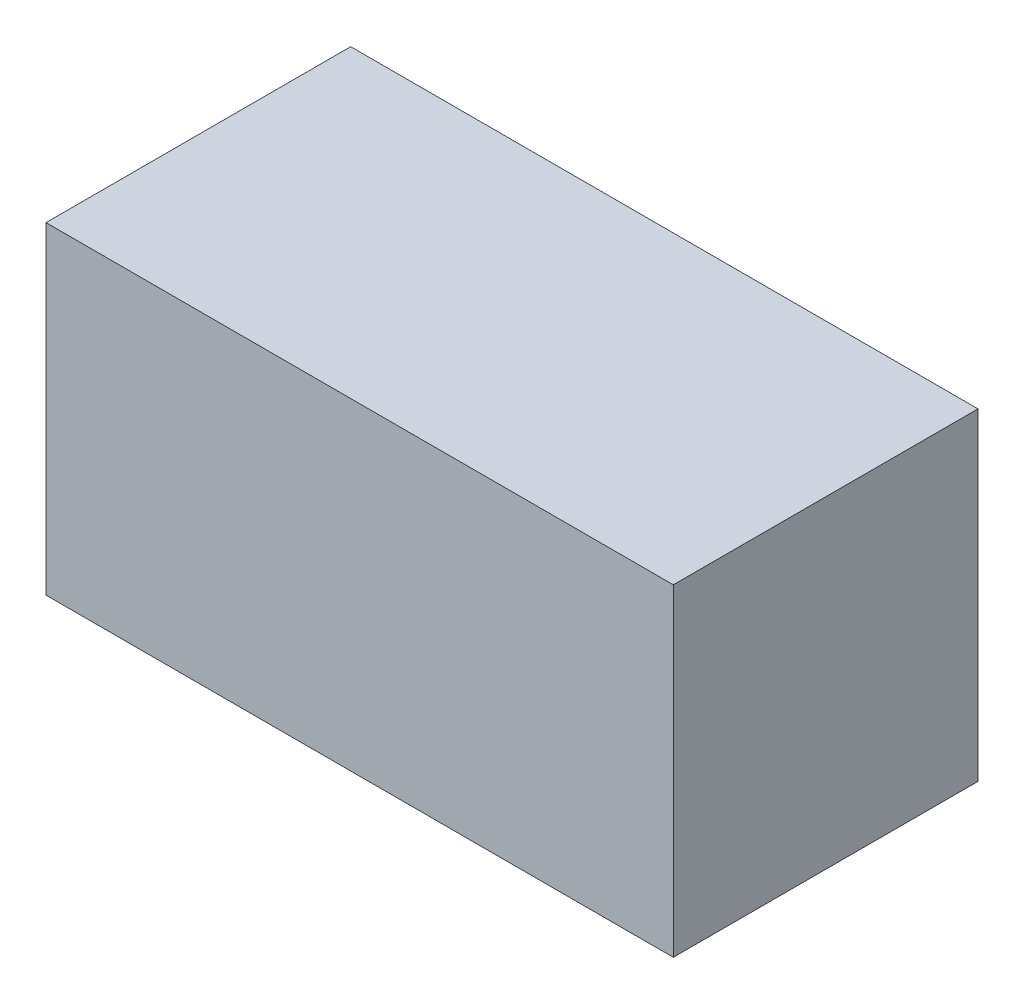
ISO-10303-21;
HEADER;
FILE_DESCRIPTION(('STEP AP214'),'2;1');
FILE_NAME('part.step','',(''),(''),'','','');
FILE_SCHEMA(('AUTOMOTIVE_DESIGN { 1 0 10303 214 1 1 1 1 }'));
ENDSEC;
DATA;
#1=APPLICATION_CONTEXT('core data for automotive mechanical design processes');
#2=APPLICATION_PROTOCOL_DEFINITION('international standard','automotive_design',2000,#1);
#3=PRODUCT_CONTEXT('',#1,'mechanical');
#4=PRODUCT('Part','Part','',(#3));
#5=PRODUCT_RELATED_PRODUCT_CATEGORY('part','',(#4));
#6=PRODUCT_DEFINITION_FORMATION('','',#4);
#7=PRODUCT_DEFINITION_CONTEXT('part definition',#1,'design');
#8=PRODUCT_DEFINITION('design','',#6,#7);
#9=PRODUCT_DEFINITION_SHAPE('','',#8);
#10=(LENGTH_UNIT() NAMED_UNIT(*) SI_UNIT(.MILLI.,.METRE.));
#11=(NAMED_UNIT(*) PLANE_ANGLE_UNIT() SI_UNIT($,.RADIAN.));
#12=(NAMED_UNIT(*) SI_UNIT($,.STERADIAN.) SOLID_ANGLE_UNIT());
#13=UNCERTAINTY_MEASURE_WITH_UNIT(LENGTH_MEASURE(1.E-05),#10,'distance_accuracy_value','');
#14=(GEOMETRIC_REPRESENTATION_CONTEXT(3) GLOBAL_UNCERTAINTY_ASSIGNED_CONTEXT((#13)) GLOBAL_UNIT_ASSIGNED_CONTEXT((#10,
#11,#12)) REPRESENTATION_CONTEXT('',''));
#15=CARTESIAN_POINT('',(0.,0.,0.));
#16=DIRECTION('',(0.,0.,1.));
#17=DIRECTION('',(1.,0.,0.));
#18=AXIS2_PLACEMENT_3D('',#15,#16,#17);
#19=CARTESIAN_POINT('',(35.,-18.,34.));
#20=DIRECTION('',(-1.,0.,0.));
#21=DIRECTION('',(0.,0.,1.));
#22=AXIS2_PLACEMENT_3D('',#19,#20,#21);
#23=PLANE('',#22);
#24=DIRECTION('',(0.,1.,0.));
#25=VECTOR('',#24,1.);
#26=CARTESIAN_POINT('',(35.,-18.,0.));
#27=LINE('',#26,#25);
#28=CARTESIAN_POINT('',(35.,-18.,0.));
#29=VERTEX_POINT('',#28);
#30=CARTESIAN_POINT('',(35.,18.,0.));
#31=VERTEX_POINT('',#30);
#32=EDGE_CURVE('E102',#29,#31,#27,.T.);
#33=ORIENTED_EDGE('',*,*,#32,.T.);
#34=DIRECTION('',(0.,0.,-1.));
#35=VECTOR('',#34,1.);
#36=CARTESIAN_POINT('',(35.,18.,34.));
#37=LINE('',#36,#35);
#38=CARTESIAN_POINT('',(35.,18.,34.));
#39=VERTEX_POINT('',#38);
#40=EDGE_CURVE('E11',#39,#31,#37,.T.);
#41=ORIENTED_EDGE('',*,*,#40,.F.);
#42=DIRECTION('',(0.,1.,0.));
#43=VECTOR('',#42,1.);
#44=CARTESIAN_POINT('',(35.,-18.,34.));
#45=LINE('',#44,#43);
#46=CARTESIAN_POINT('',(35.,-18.,34.));
#47=VERTEX_POINT('',#46);
#48=EDGE_CURVE('E95',#47,#39,#45,.T.);
#49=ORIENTED_EDGE('',*,*,#48,.F.);
#50=DIRECTION('',(0.,0.,-1.));
#51=VECTOR('',#50,1.);
#52=CARTESIAN_POINT('',(35.,-18.,34.));
#53=LINE('',#52,#51);
#54=EDGE_CURVE('E99',#47,#29,#53,.T.);
#55=ORIENTED_EDGE('',*,*,#54,.T.);
#56=EDGE_LOOP('',(#33,#41,#49,#55));
#57=FACE_BOUND('',#56,.T.);
#58=ADVANCED_FACE('F41',(#57),#23,.F.);
#59=CARTESIAN_POINT('',(-35.,18.,34.));
#60=DIRECTION('',(0.,-1.,0.));
#61=DIRECTION('',(0.,0.,-1.));
#62=AXIS2_PLACEMENT_3D('',#59,#60,#61);
#63=PLANE('',#62);
#64=DIRECTION('',(-1.,0.,0.));
#65=VECTOR('',#64,1.);
#66=CARTESIAN_POINT('',(-35.,18.,0.));
#67=LINE('',#66,#65);
#68=CARTESIAN_POINT('',(-35.,18.,0.));
#69=VERTEX_POINT('',#68);
#70=EDGE_CURVE('E96',#31,#69,#67,.T.);
#71=ORIENTED_EDGE('',*,*,#70,.T.);
#72=DIRECTION('',(0.,0.,-1.));
#73=VECTOR('',#72,1.);
#74=CARTESIAN_POINT('',(-35.,18.,34.));
#75=LINE('',#74,#73);
#76=CARTESIAN_POINT('',(-35.,18.,34.));
#77=VERTEX_POINT('',#76);
#78=EDGE_CURVE('E47',#77,#69,#75,.T.);
#79=ORIENTED_EDGE('',*,*,#78,.F.);
#80=DIRECTION('',(-1.,0.,0.));
#81=VECTOR('',#80,1.);
#82=CARTESIAN_POINT('',(-35.,18.,34.));
#83=LINE('',#82,#81);
#84=EDGE_CURVE('E87',#39,#77,#83,.T.);
#85=ORIENTED_EDGE('',*,*,#84,.F.);
#86=ORIENTED_EDGE('',*,*,#40,.T.);
#87=EDGE_LOOP('',(#71,#79,#85,#86));
#88=FACE_BOUND('',#87,.T.);
#89=ADVANCED_FACE('F92',(#88),#63,.F.);
#90=CARTESIAN_POINT('',(-35.,-18.,34.));
#91=DIRECTION('',(1.,0.,0.));
#92=DIRECTION('',(0.,0.,-1.));
#93=AXIS2_PLACEMENT_3D('',#90,#91,#92);
#94=PLANE('',#93);
#95=DIRECTION('',(0.,-1.,0.));
#96=VECTOR('',#95,1.);
#97=CARTESIAN_POINT('',(-35.,-18.,0.));
#98=LINE('',#97,#96);
#99=CARTESIAN_POINT('',(-35.,-18.,0.));
#100=VERTEX_POINT('',#99);
#101=EDGE_CURVE('E74',#69,#100,#98,.T.);
#102=ORIENTED_EDGE('',*,*,#101,.T.);
#103=DIRECTION('',(0.,0.,-1.));
#104=VECTOR('',#103,1.);
#105=CARTESIAN_POINT('',(-35.,-18.,34.));
#106=LINE('',#105,#104);
#107=CARTESIAN_POINT('',(-35.,-18.,34.));
#108=VERTEX_POINT('',#107);
#109=EDGE_CURVE('E100',#108,#100,#106,.T.);
#110=ORIENTED_EDGE('',*,*,#109,.F.);
#111=DIRECTION('',(0.,-1.,0.));
#112=VECTOR('',#111,1.);
#113=CARTESIAN_POINT('',(-35.,-18.,34.));
#114=LINE('',#113,#112);
#115=EDGE_CURVE('E89',#77,#108,#114,.T.);
#116=ORIENTED_EDGE('',*,*,#115,.F.);
#117=ORIENTED_EDGE('',*,*,#78,.T.);
#118=EDGE_LOOP('',(#102,#110,#116,#117));
#119=FACE_BOUND('',#118,.T.);
#120=ADVANCED_FACE('F98',(#119),#94,.F.);
#121=CARTESIAN_POINT('',(-35.,-18.,34.));
#122=DIRECTION('',(0.,1.,0.));
#123=DIRECTION('',(0.,0.,1.));
#124=AXIS2_PLACEMENT_3D('',#121,#122,#123);
#125=PLANE('',#124);
#126=DIRECTION('',(1.,0.,0.));
#127=VECTOR('',#126,1.);
#128=CARTESIAN_POINT('',(-35.,-18.,0.));
#129=LINE('',#128,#127);
#130=EDGE_CURVE('E76',#100,#29,#129,.T.);
#131=ORIENTED_EDGE('',*,*,#130,.T.);
#132=ORIENTED_EDGE('',*,*,#54,.F.);
#133=DIRECTION('',(1.,0.,0.));
#134=VECTOR('',#133,1.);
#135=CARTESIAN_POINT('',(-35.,-18.,34.));
#136=LINE('',#135,#134);
#137=EDGE_CURVE('E60',#108,#47,#136,.T.);
#138=ORIENTED_EDGE('',*,*,#137,.F.);
#139=ORIENTED_EDGE('',*,*,#109,.T.);
#140=EDGE_LOOP('',(#131,#132,#138,#139));
#141=FACE_BOUND('',#140,.T.);
#142=ADVANCED_FACE('F112',(#141),#125,.F.);
#143=CARTESIAN_POINT('',(0.,0.,34.));
#144=DIRECTION('',(0.,0.,-1.));
#145=DIRECTION('',(-1.,0.,0.));
#146=AXIS2_PLACEMENT_3D('',#143,#144,#145);
#147=PLANE('',#146);
#148=ORIENTED_EDGE('',*,*,#48,.T.);
#149=ORIENTED_EDGE('',*,*,#84,.T.);
#150=ORIENTED_EDGE('',*,*,#115,.T.);
#151=ORIENTED_EDGE('',*,*,#137,.T.);
#152=EDGE_LOOP('',(#148,#149,#150,#151));
#153=FACE_BOUND('',#152,.T.);
#154=ADVANCED_FACE('F86',(#153),#147,.F.);
#155=CARTESIAN_POINT('',(0.,0.,0.));
#156=DIRECTION('',(0.,0.,-1.));
#157=DIRECTION('',(-1.,0.,0.));
#158=AXIS2_PLACEMENT_3D('',#155,#156,#157);
#159=PLANE('',#158);
#160=ORIENTED_EDGE('',*,*,#32,.F.);
#161=ORIENTED_EDGE('',*,*,#130,.F.);
#162=ORIENTED_EDGE('',*,*,#101,.F.);
#163=ORIENTED_EDGE('',*,*,#70,.F.);
#164=EDGE_LOOP('',(#160,#161,#162,#163));
#165=FACE_BOUND('',#164,.T.);
#166=ADVANCED_FACE('F111',(#165),#159,.T.);
#167=CLOSED_SHELL('',(#58,#89,#120,#142,#154,#166));
#168=MANIFOLD_SOLID_BREP('B2',#167);
#169=ADVANCED_BREP_SHAPE_REPRESENTATION('',(#18,#168),#14);
#170=SHAPE_DEFINITION_REPRESENTATION(#9,#169);
ENDSEC;
END-ISO-10303-21;
